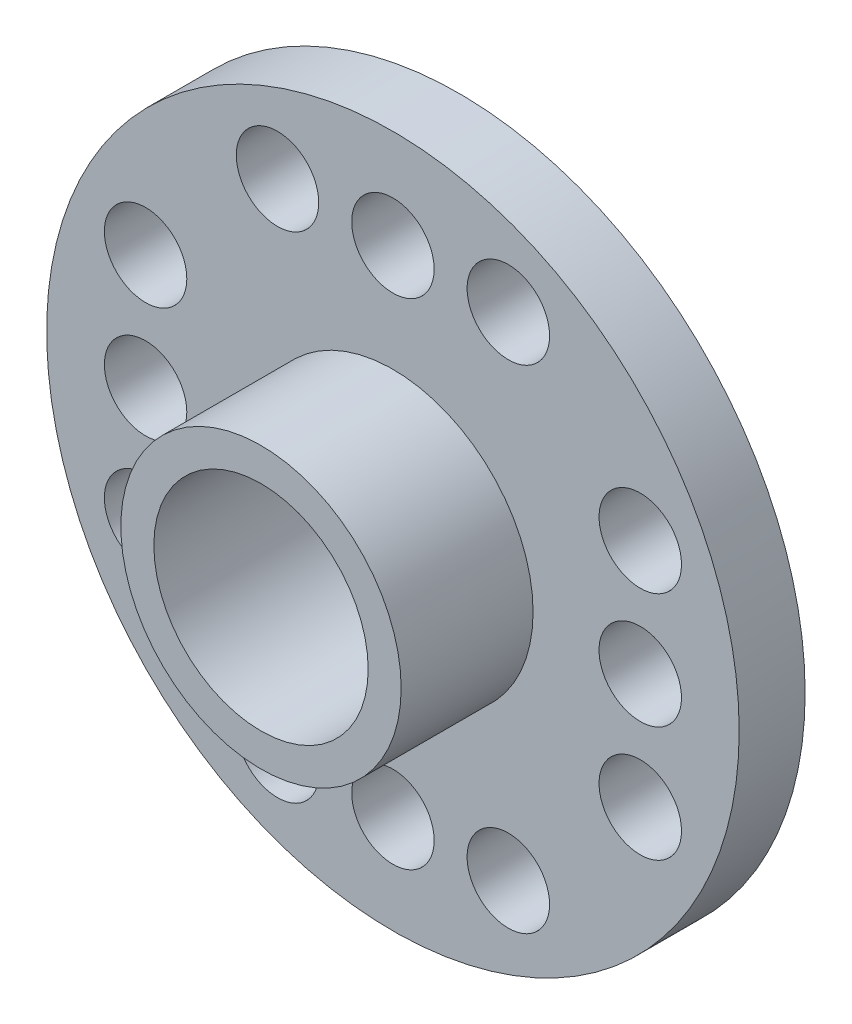
ISO-10303-21;
HEADER;
FILE_DESCRIPTION(('STEP AP214'),'2;1');
FILE_NAME('part.step','',(''),(''),'','','');
FILE_SCHEMA(('AUTOMOTIVE_DESIGN { 1 0 10303 214 1 1 1 1 }'));
ENDSEC;
DATA;
#1=APPLICATION_CONTEXT('core data for automotive mechanical design processes');
#2=APPLICATION_PROTOCOL_DEFINITION('international standard','automotive_design',2000,#1);
#3=PRODUCT_CONTEXT('',#1,'mechanical');
#4=PRODUCT('Part','Part','',(#3));
#5=PRODUCT_RELATED_PRODUCT_CATEGORY('part','',(#4));
#6=PRODUCT_DEFINITION_FORMATION('','',#4);
#7=PRODUCT_DEFINITION_CONTEXT('part definition',#1,'design');
#8=PRODUCT_DEFINITION('design','',#6,#7);
#9=PRODUCT_DEFINITION_SHAPE('','',#8);
#10=(LENGTH_UNIT() NAMED_UNIT(*) SI_UNIT(.MILLI.,.METRE.));
#11=(NAMED_UNIT(*) PLANE_ANGLE_UNIT() SI_UNIT($,.RADIAN.));
#12=(NAMED_UNIT(*) SI_UNIT($,.STERADIAN.) SOLID_ANGLE_UNIT());
#13=UNCERTAINTY_MEASURE_WITH_UNIT(LENGTH_MEASURE(1.E-05),#10,'distance_accuracy_value','');
#14=(GEOMETRIC_REPRESENTATION_CONTEXT(3) GLOBAL_UNCERTAINTY_ASSIGNED_CONTEXT((#13)) GLOBAL_UNIT_ASSIGNED_CONTEXT((#10,
#11,#12)) REPRESENTATION_CONTEXT('',''));
#15=CARTESIAN_POINT('',(0.,0.,0.));
#16=DIRECTION('',(0.,0.,1.));
#17=DIRECTION('',(1.,0.,0.));
#18=AXIS2_PLACEMENT_3D('',#15,#16,#17);
#19=CARTESIAN_POINT('',(0.,0.,2.));
#20=DIRECTION('',(0.,0.,1.));
#21=DIRECTION('',(1.,0.,0.));
#22=AXIS2_PLACEMENT_3D('',#19,#20,#21);
#23=PLANE('',#22);
#24=CARTESIAN_POINT('',(7.5,-3.5,2.));
#25=DIRECTION('',(0.,0.,1.));
#26=DIRECTION('',(1.,0.,0.));
#27=AXIS2_PLACEMENT_3D('',#24,#25,#26);
#28=CIRCLE('',#27,1.25);
#29=CARTESIAN_POINT('',(8.75,-3.5,2.));
#30=VERTEX_POINT('',#29);
#31=EDGE_CURVE('E106',#30,#30,#28,.T.);
#32=ORIENTED_EDGE('',*,*,#31,.F.);
#33=EDGE_LOOP('',(#32));
#34=FACE_BOUND('',#33,.T.);
#35=CARTESIAN_POINT('',(-3.5,-7.5,2.));
#36=DIRECTION('',(0.,0.,1.));
#37=DIRECTION('',(1.,0.,0.));
#38=AXIS2_PLACEMENT_3D('',#35,#36,#37);
#39=CIRCLE('',#38,1.25);
#40=CARTESIAN_POINT('',(-2.25,-7.5,2.));
#41=VERTEX_POINT('',#40);
#42=EDGE_CURVE('E94',#41,#41,#39,.T.);
#43=ORIENTED_EDGE('',*,*,#42,.F.);
#44=EDGE_LOOP('',(#43));
#45=FACE_BOUND('',#44,.T.);
#46=CARTESIAN_POINT('',(7.5,3.5,2.));
#47=DIRECTION('',(0.,0.,1.));
#48=DIRECTION('',(1.,0.,0.));
#49=AXIS2_PLACEMENT_3D('',#46,#47,#48);
#50=CIRCLE('',#49,1.25);
#51=CARTESIAN_POINT('',(8.75,3.5,2.));
#52=VERTEX_POINT('',#51);
#53=EDGE_CURVE('E82',#52,#52,#50,.T.);
#54=ORIENTED_EDGE('',*,*,#53,.F.);
#55=EDGE_LOOP('',(#54));
#56=FACE_BOUND('',#55,.T.);
#57=CARTESIAN_POINT('',(7.5,0.,2.));
#58=DIRECTION('',(0.,0.,1.));
#59=DIRECTION('',(1.,0.,0.));
#60=AXIS2_PLACEMENT_3D('',#57,#58,#59);
#61=CIRCLE('',#60,1.25);
#62=CARTESIAN_POINT('',(8.75,0.,2.));
#63=VERTEX_POINT('',#62);
#64=EDGE_CURVE('E70',#63,#63,#61,.T.);
#65=ORIENTED_EDGE('',*,*,#64,.F.);
#66=EDGE_LOOP('',(#65));
#67=FACE_BOUND('',#66,.T.);
#68=CARTESIAN_POINT('',(-7.5,0.,2.));
#69=DIRECTION('',(0.,0.,1.));
#70=DIRECTION('',(1.,0.,0.));
#71=AXIS2_PLACEMENT_3D('',#68,#69,#70);
#72=CIRCLE('',#71,1.25);
#73=CARTESIAN_POINT('',(-6.25,0.,2.));
#74=VERTEX_POINT('',#73);
#75=EDGE_CURVE('E58',#74,#74,#72,.T.);
#76=ORIENTED_EDGE('',*,*,#75,.F.);
#77=EDGE_LOOP('',(#76));
#78=FACE_BOUND('',#77,.T.);
#79=CARTESIAN_POINT('',(-3.5,7.5,2.));
#80=DIRECTION('',(0.,0.,1.));
#81=DIRECTION('',(1.,0.,0.));
#82=AXIS2_PLACEMENT_3D('',#79,#80,#81);
#83=CIRCLE('',#82,1.25);
#84=CARTESIAN_POINT('',(-2.25,7.5,2.));
#85=VERTEX_POINT('',#84);
#86=EDGE_CURVE('E46',#85,#85,#83,.T.);
#87=ORIENTED_EDGE('',*,*,#86,.F.);
#88=EDGE_LOOP('',(#87));
#89=FACE_BOUND('',#88,.T.);
#90=CARTESIAN_POINT('',(0.,0.,2.));
#91=DIRECTION('',(0.,0.,1.));
#92=DIRECTION('',(1.,0.,0.));
#93=AXIS2_PLACEMENT_3D('',#90,#91,#92);
#94=CIRCLE('',#93,10.5);
#95=CARTESIAN_POINT('',(10.5,0.,2.));
#96=VERTEX_POINT('',#95);
#97=EDGE_CURVE('E10',#96,#96,#94,.T.);
#98=ORIENTED_EDGE('',*,*,#97,.T.);
#99=EDGE_LOOP('',(#98));
#100=FACE_BOUND('',#99,.T.);
#101=CARTESIAN_POINT('',(0.,7.5,2.));
#102=DIRECTION('',(0.,0.,1.));
#103=DIRECTION('',(1.,0.,0.));
#104=AXIS2_PLACEMENT_3D('',#101,#102,#103);
#105=CIRCLE('',#104,1.25);
#106=CARTESIAN_POINT('',(1.25,7.5,2.));
#107=VERTEX_POINT('',#106);
#108=EDGE_CURVE('E41',#107,#107,#105,.T.);
#109=ORIENTED_EDGE('',*,*,#108,.F.);
#110=EDGE_LOOP('',(#109));
#111=FACE_BOUND('',#110,.T.);
#112=CARTESIAN_POINT('',(3.5,7.5,2.));
#113=DIRECTION('',(0.,0.,1.));
#114=DIRECTION('',(1.,0.,0.));
#115=AXIS2_PLACEMENT_3D('',#112,#113,#114);
#116=CIRCLE('',#115,1.25);
#117=CARTESIAN_POINT('',(4.75,7.5,2.));
#118=VERTEX_POINT('',#117);
#119=EDGE_CURVE('E52',#118,#118,#116,.T.);
#120=ORIENTED_EDGE('',*,*,#119,.F.);
#121=EDGE_LOOP('',(#120));
#122=FACE_BOUND('',#121,.T.);
#123=CARTESIAN_POINT('',(-7.5,3.5,2.));
#124=DIRECTION('',(0.,0.,1.));
#125=DIRECTION('',(1.,0.,0.));
#126=AXIS2_PLACEMENT_3D('',#123,#124,#125);
#127=CIRCLE('',#126,1.25);
#128=CARTESIAN_POINT('',(-6.25,3.5,2.));
#129=VERTEX_POINT('',#128);
#130=EDGE_CURVE('E64',#129,#129,#127,.T.);
#131=ORIENTED_EDGE('',*,*,#130,.F.);
#132=EDGE_LOOP('',(#131));
#133=FACE_BOUND('',#132,.T.);
#134=CARTESIAN_POINT('',(-7.5,-3.5,2.));
#135=DIRECTION('',(0.,0.,1.));
#136=DIRECTION('',(1.,0.,0.));
#137=AXIS2_PLACEMENT_3D('',#134,#135,#136);
#138=CIRCLE('',#137,1.25);
#139=CARTESIAN_POINT('',(-6.25,-3.5,2.));
#140=VERTEX_POINT('',#139);
#141=EDGE_CURVE('E76',#140,#140,#138,.T.);
#142=ORIENTED_EDGE('',*,*,#141,.F.);
#143=EDGE_LOOP('',(#142));
#144=FACE_BOUND('',#143,.T.);
#145=CARTESIAN_POINT('',(0.,-7.5,2.));
#146=DIRECTION('',(0.,0.,1.));
#147=DIRECTION('',(1.,0.,0.));
#148=AXIS2_PLACEMENT_3D('',#145,#146,#147);
#149=CIRCLE('',#148,1.25);
#150=CARTESIAN_POINT('',(1.25,-7.5,2.));
#151=VERTEX_POINT('',#150);
#152=EDGE_CURVE('E88',#151,#151,#149,.T.);
#153=ORIENTED_EDGE('',*,*,#152,.F.);
#154=EDGE_LOOP('',(#153));
#155=FACE_BOUND('',#154,.T.);
#156=CARTESIAN_POINT('',(3.49926490451762,-7.42827045231363,2.));
#157=DIRECTION('',(0.,0.,1.));
#158=DIRECTION('',(1.,0.,0.));
#159=AXIS2_PLACEMENT_3D('',#156,#157,#158);
#160=CIRCLE('',#159,1.25);
#161=CARTESIAN_POINT('',(4.74926490451762,-7.42827045231363,2.));
#162=VERTEX_POINT('',#161);
#163=EDGE_CURVE('E100',#162,#162,#160,.T.);
#164=ORIENTED_EDGE('',*,*,#163,.F.);
#165=EDGE_LOOP('',(#164));
#166=FACE_BOUND('',#165,.T.);
#167=CARTESIAN_POINT('',(0.,0.,2.));
#168=DIRECTION('',(0.,0.,1.));
#169=DIRECTION('',(1.,0.,0.));
#170=AXIS2_PLACEMENT_3D('',#167,#168,#169);
#171=CIRCLE('',#170,4.25);
#172=CARTESIAN_POINT('',(4.25,0.,2.));
#173=VERTEX_POINT('',#172);
#174=EDGE_CURVE('E118',#173,#173,#171,.T.);
#175=ORIENTED_EDGE('',*,*,#174,.F.);
#176=EDGE_LOOP('',(#175));
#177=FACE_BOUND('',#176,.T.);
#178=ADVANCED_FACE('F30',(#34,#45,#56,#67,#78,#89,#100,#111,#122,#133,#144,#155,#166,#177),#23,.T.);
#179=CARTESIAN_POINT('',(0.,0.,0.));
#180=DIRECTION('',(0.,0.,1.));
#181=DIRECTION('',(1.,0.,0.));
#182=AXIS2_PLACEMENT_3D('',#179,#180,#181);
#183=PLANE('',#182);
#184=CARTESIAN_POINT('',(0.,0.,0.));
#185=DIRECTION('',(0.,0.,-1.));
#186=DIRECTION('',(-1.,0.,0.));
#187=AXIS2_PLACEMENT_3D('',#184,#185,#186);
#188=CIRCLE('',#187,3.25);
#189=CARTESIAN_POINT('',(-3.25,0.,0.));
#190=VERTEX_POINT('',#189);
#191=EDGE_CURVE('E112',#190,#190,#188,.T.);
#192=ORIENTED_EDGE('',*,*,#191,.F.);
#193=EDGE_LOOP('',(#192));
#194=FACE_BOUND('',#193,.T.);
#195=CARTESIAN_POINT('',(0.,0.,0.));
#196=DIRECTION('',(0.,0.,1.));
#197=DIRECTION('',(1.,0.,0.));
#198=AXIS2_PLACEMENT_3D('',#195,#196,#197);
#199=CIRCLE('',#198,10.5);
#200=CARTESIAN_POINT('',(10.5,0.,0.));
#201=VERTEX_POINT('',#200);
#202=EDGE_CURVE('E34',#201,#201,#199,.T.);
#203=ORIENTED_EDGE('',*,*,#202,.F.);
#204=EDGE_LOOP('',(#203));
#205=FACE_BOUND('',#204,.T.);
#206=CARTESIAN_POINT('',(0.,7.5,0.));
#207=DIRECTION('',(0.,0.,1.));
#208=DIRECTION('',(1.,0.,0.));
#209=AXIS2_PLACEMENT_3D('',#206,#207,#208);
#210=CIRCLE('',#209,1.25);
#211=CARTESIAN_POINT('',(1.25,7.5,0.));
#212=VERTEX_POINT('',#211);
#213=EDGE_CURVE('E43',#212,#212,#210,.T.);
#214=ORIENTED_EDGE('',*,*,#213,.T.);
#215=EDGE_LOOP('',(#214));
#216=FACE_BOUND('',#215,.T.);
#217=CARTESIAN_POINT('',(-3.5,7.5,0.));
#218=DIRECTION('',(0.,0.,1.));
#219=DIRECTION('',(1.,0.,0.));
#220=AXIS2_PLACEMENT_3D('',#217,#218,#219);
#221=CIRCLE('',#220,1.25);
#222=CARTESIAN_POINT('',(-2.25,7.5,0.));
#223=VERTEX_POINT('',#222);
#224=EDGE_CURVE('E49',#223,#223,#221,.T.);
#225=ORIENTED_EDGE('',*,*,#224,.T.);
#226=EDGE_LOOP('',(#225));
#227=FACE_BOUND('',#226,.T.);
#228=CARTESIAN_POINT('',(3.5,7.5,0.));
#229=DIRECTION('',(0.,0.,1.));
#230=DIRECTION('',(1.,0.,0.));
#231=AXIS2_PLACEMENT_3D('',#228,#229,#230);
#232=CIRCLE('',#231,1.25);
#233=CARTESIAN_POINT('',(4.75,7.5,0.));
#234=VERTEX_POINT('',#233);
#235=EDGE_CURVE('E55',#234,#234,#232,.T.);
#236=ORIENTED_EDGE('',*,*,#235,.T.);
#237=EDGE_LOOP('',(#236));
#238=FACE_BOUND('',#237,.T.);
#239=CARTESIAN_POINT('',(-7.5,0.,0.));
#240=DIRECTION('',(0.,0.,1.));
#241=DIRECTION('',(1.,0.,0.));
#242=AXIS2_PLACEMENT_3D('',#239,#240,#241);
#243=CIRCLE('',#242,1.25);
#244=CARTESIAN_POINT('',(-6.25,0.,0.));
#245=VERTEX_POINT('',#244);
#246=EDGE_CURVE('E61',#245,#245,#243,.T.);
#247=ORIENTED_EDGE('',*,*,#246,.T.);
#248=EDGE_LOOP('',(#247));
#249=FACE_BOUND('',#248,.T.);
#250=CARTESIAN_POINT('',(-7.5,3.5,0.));
#251=DIRECTION('',(0.,0.,1.));
#252=DIRECTION('',(1.,0.,0.));
#253=AXIS2_PLACEMENT_3D('',#250,#251,#252);
#254=CIRCLE('',#253,1.25);
#255=CARTESIAN_POINT('',(-6.25,3.5,0.));
#256=VERTEX_POINT('',#255);
#257=EDGE_CURVE('E67',#256,#256,#254,.T.);
#258=ORIENTED_EDGE('',*,*,#257,.T.);
#259=EDGE_LOOP('',(#258));
#260=FACE_BOUND('',#259,.T.);
#261=CARTESIAN_POINT('',(7.5,0.,0.));
#262=DIRECTION('',(0.,0.,1.));
#263=DIRECTION('',(1.,0.,0.));
#264=AXIS2_PLACEMENT_3D('',#261,#262,#263);
#265=CIRCLE('',#264,1.25);
#266=CARTESIAN_POINT('',(8.75,0.,0.));
#267=VERTEX_POINT('',#266);
#268=EDGE_CURVE('E73',#267,#267,#265,.T.);
#269=ORIENTED_EDGE('',*,*,#268,.T.);
#270=EDGE_LOOP('',(#269));
#271=FACE_BOUND('',#270,.T.);
#272=CARTESIAN_POINT('',(-7.5,-3.5,0.));
#273=DIRECTION('',(0.,0.,1.));
#274=DIRECTION('',(1.,0.,0.));
#275=AXIS2_PLACEMENT_3D('',#272,#273,#274);
#276=CIRCLE('',#275,1.25);
#277=CARTESIAN_POINT('',(-6.25,-3.5,0.));
#278=VERTEX_POINT('',#277);
#279=EDGE_CURVE('E79',#278,#278,#276,.T.);
#280=ORIENTED_EDGE('',*,*,#279,.T.);
#281=EDGE_LOOP('',(#280));
#282=FACE_BOUND('',#281,.T.);
#283=CARTESIAN_POINT('',(7.5,3.5,0.));
#284=DIRECTION('',(0.,0.,1.));
#285=DIRECTION('',(1.,0.,0.));
#286=AXIS2_PLACEMENT_3D('',#283,#284,#285);
#287=CIRCLE('',#286,1.25);
#288=CARTESIAN_POINT('',(8.75,3.5,0.));
#289=VERTEX_POINT('',#288);
#290=EDGE_CURVE('E85',#289,#289,#287,.T.);
#291=ORIENTED_EDGE('',*,*,#290,.T.);
#292=EDGE_LOOP('',(#291));
#293=FACE_BOUND('',#292,.T.);
#294=CARTESIAN_POINT('',(0.,-7.5,0.));
#295=DIRECTION('',(0.,0.,1.));
#296=DIRECTION('',(1.,0.,0.));
#297=AXIS2_PLACEMENT_3D('',#294,#295,#296);
#298=CIRCLE('',#297,1.25);
#299=CARTESIAN_POINT('',(1.25,-7.5,0.));
#300=VERTEX_POINT('',#299);
#301=EDGE_CURVE('E91',#300,#300,#298,.T.);
#302=ORIENTED_EDGE('',*,*,#301,.T.);
#303=EDGE_LOOP('',(#302));
#304=FACE_BOUND('',#303,.T.);
#305=CARTESIAN_POINT('',(-3.5,-7.5,0.));
#306=DIRECTION('',(0.,0.,1.));
#307=DIRECTION('',(1.,0.,0.));
#308=AXIS2_PLACEMENT_3D('',#305,#306,#307);
#309=CIRCLE('',#308,1.25);
#310=CARTESIAN_POINT('',(-2.25,-7.5,0.));
#311=VERTEX_POINT('',#310);
#312=EDGE_CURVE('E97',#311,#311,#309,.T.);
#313=ORIENTED_EDGE('',*,*,#312,.T.);
#314=EDGE_LOOP('',(#313));
#315=FACE_BOUND('',#314,.T.);
#316=CARTESIAN_POINT('',(3.49926490451762,-7.42827045231363,0.));
#317=DIRECTION('',(0.,0.,1.));
#318=DIRECTION('',(1.,0.,0.));
#319=AXIS2_PLACEMENT_3D('',#316,#317,#318);
#320=CIRCLE('',#319,1.25);
#321=CARTESIAN_POINT('',(4.74926490451762,-7.42827045231363,0.));
#322=VERTEX_POINT('',#321);
#323=EDGE_CURVE('E103',#322,#322,#320,.T.);
#324=ORIENTED_EDGE('',*,*,#323,.T.);
#325=EDGE_LOOP('',(#324));
#326=FACE_BOUND('',#325,.T.);
#327=CARTESIAN_POINT('',(7.5,-3.5,0.));
#328=DIRECTION('',(0.,0.,1.));
#329=DIRECTION('',(1.,0.,0.));
#330=AXIS2_PLACEMENT_3D('',#327,#328,#329);
#331=CIRCLE('',#330,1.25);
#332=CARTESIAN_POINT('',(8.75,-3.5,0.));
#333=VERTEX_POINT('',#332);
#334=EDGE_CURVE('E109',#333,#333,#331,.T.);
#335=ORIENTED_EDGE('',*,*,#334,.T.);
#336=EDGE_LOOP('',(#335));
#337=FACE_BOUND('',#336,.T.);
#338=ADVANCED_FACE('F144',(#194,#205,#216,#227,#238,#249,#260,#271,#282,#293,#304,#315,#326,
#337),#183,.F.);
#339=CARTESIAN_POINT('',(0.,0.,2.));
#340=DIRECTION('',(0.,0.,-1.));
#341=DIRECTION('',(-1.,0.,0.));
#342=AXIS2_PLACEMENT_3D('',#339,#340,#341);
#343=CYLINDRICAL_SURFACE('',#342,10.5);
#344=ORIENTED_EDGE('',*,*,#97,.F.);
#345=EDGE_LOOP('',(#344));
#346=FACE_BOUND('',#345,.T.);
#347=ORIENTED_EDGE('',*,*,#202,.T.);
#348=EDGE_LOOP('',(#347));
#349=FACE_BOUND('',#348,.T.);
#350=ADVANCED_FACE('F32',(#346,#349),#343,.T.);
#351=CARTESIAN_POINT('',(0.,7.5,2.));
#352=DIRECTION('',(0.,0.,-1.));
#353=DIRECTION('',(-1.,0.,0.));
#354=AXIS2_PLACEMENT_3D('',#351,#352,#353);
#355=CYLINDRICAL_SURFACE('',#354,1.25);
#356=ORIENTED_EDGE('',*,*,#108,.T.);
#357=EDGE_LOOP('',(#356));
#358=FACE_BOUND('',#357,.T.);
#359=ORIENTED_EDGE('',*,*,#213,.F.);
#360=EDGE_LOOP('',(#359));
#361=FACE_BOUND('',#360,.T.);
#362=ADVANCED_FACE('F154',(#358,#361),#355,.F.);
#363=CARTESIAN_POINT('',(-3.5,7.5,2.));
#364=DIRECTION('',(0.,0.,-1.));
#365=DIRECTION('',(-1.,0.,0.));
#366=AXIS2_PLACEMENT_3D('',#363,#364,#365);
#367=CYLINDRICAL_SURFACE('',#366,1.25);
#368=ORIENTED_EDGE('',*,*,#86,.T.);
#369=EDGE_LOOP('',(#368));
#370=FACE_BOUND('',#369,.T.);
#371=ORIENTED_EDGE('',*,*,#224,.F.);
#372=EDGE_LOOP('',(#371));
#373=FACE_BOUND('',#372,.T.);
#374=ADVANCED_FACE('F157',(#370,#373),#367,.F.);
#375=CARTESIAN_POINT('',(3.5,7.5,2.));
#376=DIRECTION('',(0.,0.,-1.));
#377=DIRECTION('',(-1.,0.,0.));
#378=AXIS2_PLACEMENT_3D('',#375,#376,#377);
#379=CYLINDRICAL_SURFACE('',#378,1.25);
#380=ORIENTED_EDGE('',*,*,#119,.T.);
#381=EDGE_LOOP('',(#380));
#382=FACE_BOUND('',#381,.T.);
#383=ORIENTED_EDGE('',*,*,#235,.F.);
#384=EDGE_LOOP('',(#383));
#385=FACE_BOUND('',#384,.T.);
#386=ADVANCED_FACE('F161',(#382,#385),#379,.F.);
#387=CARTESIAN_POINT('',(-7.5,0.,2.));
#388=DIRECTION('',(0.,0.,-1.));
#389=DIRECTION('',(-1.,0.,0.));
#390=AXIS2_PLACEMENT_3D('',#387,#388,#389);
#391=CYLINDRICAL_SURFACE('',#390,1.25);
#392=ORIENTED_EDGE('',*,*,#75,.T.);
#393=EDGE_LOOP('',(#392));
#394=FACE_BOUND('',#393,.T.);
#395=ORIENTED_EDGE('',*,*,#246,.F.);
#396=EDGE_LOOP('',(#395));
#397=FACE_BOUND('',#396,.T.);
#398=ADVANCED_FACE('F165',(#394,#397),#391,.F.);
#399=CARTESIAN_POINT('',(-7.5,3.5,2.));
#400=DIRECTION('',(0.,0.,-1.));
#401=DIRECTION('',(-1.,0.,0.));
#402=AXIS2_PLACEMENT_3D('',#399,#400,#401);
#403=CYLINDRICAL_SURFACE('',#402,1.25);
#404=ORIENTED_EDGE('',*,*,#130,.T.);
#405=EDGE_LOOP('',(#404));
#406=FACE_BOUND('',#405,.T.);
#407=ORIENTED_EDGE('',*,*,#257,.F.);
#408=EDGE_LOOP('',(#407));
#409=FACE_BOUND('',#408,.T.);
#410=ADVANCED_FACE('F169',(#406,#409),#403,.F.);
#411=CARTESIAN_POINT('',(7.5,0.,2.));
#412=DIRECTION('',(0.,0.,-1.));
#413=DIRECTION('',(-1.,0.,0.));
#414=AXIS2_PLACEMENT_3D('',#411,#412,#413);
#415=CYLINDRICAL_SURFACE('',#414,1.25);
#416=ORIENTED_EDGE('',*,*,#64,.T.);
#417=EDGE_LOOP('',(#416));
#418=FACE_BOUND('',#417,.T.);
#419=ORIENTED_EDGE('',*,*,#268,.F.);
#420=EDGE_LOOP('',(#419));
#421=FACE_BOUND('',#420,.T.);
#422=ADVANCED_FACE('F173',(#418,#421),#415,.F.);
#423=CARTESIAN_POINT('',(-7.5,-3.5,2.));
#424=DIRECTION('',(0.,0.,-1.));
#425=DIRECTION('',(-1.,0.,0.));
#426=AXIS2_PLACEMENT_3D('',#423,#424,#425);
#427=CYLINDRICAL_SURFACE('',#426,1.25);
#428=ORIENTED_EDGE('',*,*,#141,.T.);
#429=EDGE_LOOP('',(#428));
#430=FACE_BOUND('',#429,.T.);
#431=ORIENTED_EDGE('',*,*,#279,.F.);
#432=EDGE_LOOP('',(#431));
#433=FACE_BOUND('',#432,.T.);
#434=ADVANCED_FACE('F177',(#430,#433),#427,.F.);
#435=CARTESIAN_POINT('',(7.5,3.5,2.));
#436=DIRECTION('',(0.,0.,-1.));
#437=DIRECTION('',(-1.,0.,0.));
#438=AXIS2_PLACEMENT_3D('',#435,#436,#437);
#439=CYLINDRICAL_SURFACE('',#438,1.25);
#440=ORIENTED_EDGE('',*,*,#53,.T.);
#441=EDGE_LOOP('',(#440));
#442=FACE_BOUND('',#441,.T.);
#443=ORIENTED_EDGE('',*,*,#290,.F.);
#444=EDGE_LOOP('',(#443));
#445=FACE_BOUND('',#444,.T.);
#446=ADVANCED_FACE('F181',(#442,#445),#439,.F.);
#447=CARTESIAN_POINT('',(0.,-7.5,2.));
#448=DIRECTION('',(0.,0.,-1.));
#449=DIRECTION('',(-1.,0.,0.));
#450=AXIS2_PLACEMENT_3D('',#447,#448,#449);
#451=CYLINDRICAL_SURFACE('',#450,1.25);
#452=ORIENTED_EDGE('',*,*,#152,.T.);
#453=EDGE_LOOP('',(#452));
#454=FACE_BOUND('',#453,.T.);
#455=ORIENTED_EDGE('',*,*,#301,.F.);
#456=EDGE_LOOP('',(#455));
#457=FACE_BOUND('',#456,.T.);
#458=ADVANCED_FACE('F185',(#454,#457),#451,.F.);
#459=CARTESIAN_POINT('',(-3.5,-7.5,2.));
#460=DIRECTION('',(0.,0.,-1.));
#461=DIRECTION('',(-1.,0.,0.));
#462=AXIS2_PLACEMENT_3D('',#459,#460,#461);
#463=CYLINDRICAL_SURFACE('',#462,1.25);
#464=ORIENTED_EDGE('',*,*,#42,.T.);
#465=EDGE_LOOP('',(#464));
#466=FACE_BOUND('',#465,.T.);
#467=ORIENTED_EDGE('',*,*,#312,.F.);
#468=EDGE_LOOP('',(#467));
#469=FACE_BOUND('',#468,.T.);
#470=ADVANCED_FACE('F189',(#466,#469),#463,.F.);
#471=CARTESIAN_POINT('',(3.49926490451762,-7.42827045231363,2.));
#472=DIRECTION('',(0.,0.,-1.));
#473=DIRECTION('',(-1.,0.,0.));
#474=AXIS2_PLACEMENT_3D('',#471,#472,#473);
#475=CYLINDRICAL_SURFACE('',#474,1.25);
#476=ORIENTED_EDGE('',*,*,#163,.T.);
#477=EDGE_LOOP('',(#476));
#478=FACE_BOUND('',#477,.T.);
#479=ORIENTED_EDGE('',*,*,#323,.F.);
#480=EDGE_LOOP('',(#479));
#481=FACE_BOUND('',#480,.T.);
#482=ADVANCED_FACE('F193',(#478,#481),#475,.F.);
#483=CARTESIAN_POINT('',(7.5,-3.5,2.));
#484=DIRECTION('',(0.,0.,-1.));
#485=DIRECTION('',(-1.,0.,0.));
#486=AXIS2_PLACEMENT_3D('',#483,#484,#485);
#487=CYLINDRICAL_SURFACE('',#486,1.25);
#488=ORIENTED_EDGE('',*,*,#31,.T.);
#489=EDGE_LOOP('',(#488));
#490=FACE_BOUND('',#489,.T.);
#491=ORIENTED_EDGE('',*,*,#334,.F.);
#492=EDGE_LOOP('',(#491));
#493=FACE_BOUND('',#492,.T.);
#494=ADVANCED_FACE('F140',(#490,#493),#487,.F.);
#495=CARTESIAN_POINT('',(0.,0.,2.));
#496=DIRECTION('',(0.,0.,-1.));
#497=DIRECTION('',(-1.,0.,0.));
#498=AXIS2_PLACEMENT_3D('',#495,#496,#497);
#499=CYLINDRICAL_SURFACE('',#498,3.25);
#500=ORIENTED_EDGE('',*,*,#191,.T.);
#501=EDGE_LOOP('',(#500));
#502=FACE_BOUND('',#501,.T.);
#503=CARTESIAN_POINT('',(0.,0.,6.));
#504=DIRECTION('',(0.,0.,1.));
#505=DIRECTION('',(1.,0.,0.));
#506=AXIS2_PLACEMENT_3D('',#503,#504,#505);
#507=CIRCLE('',#506,3.25);
#508=CARTESIAN_POINT('',(3.25,0.,6.));
#509=VERTEX_POINT('',#508);
#510=EDGE_CURVE('E121',#509,#509,#507,.T.);
#511=ORIENTED_EDGE('',*,*,#510,.T.);
#512=EDGE_LOOP('',(#511));
#513=FACE_BOUND('',#512,.T.);
#514=ADVANCED_FACE('F127',(#502,#513),#499,.F.);
#515=CARTESIAN_POINT('',(0.,0.,6.));
#516=DIRECTION('',(0.,0.,1.));
#517=DIRECTION('',(1.,0.,0.));
#518=AXIS2_PLACEMENT_3D('',#515,#516,#517);
#519=PLANE('',#518);
#520=CARTESIAN_POINT('',(0.,0.,6.));
#521=DIRECTION('',(0.,0.,1.));
#522=DIRECTION('',(1.,0.,0.));
#523=AXIS2_PLACEMENT_3D('',#520,#521,#522);
#524=CIRCLE('',#523,4.25);
#525=CARTESIAN_POINT('',(4.25,0.,6.));
#526=VERTEX_POINT('',#525);
#527=EDGE_CURVE('E117',#526,#526,#524,.T.);
#528=ORIENTED_EDGE('',*,*,#527,.T.);
#529=EDGE_LOOP('',(#528));
#530=FACE_BOUND('',#529,.T.);
#531=ORIENTED_EDGE('',*,*,#510,.F.);
#532=EDGE_LOOP('',(#531));
#533=FACE_BOUND('',#532,.T.);
#534=ADVANCED_FACE('F129',(#530,#533),#519,.T.);
#535=CARTESIAN_POINT('',(0.,0.,6.));
#536=DIRECTION('',(0.,0.,-1.));
#537=DIRECTION('',(-1.,0.,0.));
#538=AXIS2_PLACEMENT_3D('',#535,#536,#537);
#539=CYLINDRICAL_SURFACE('',#538,4.25);
#540=ORIENTED_EDGE('',*,*,#527,.F.);
#541=EDGE_LOOP('',(#540));
#542=FACE_BOUND('',#541,.T.);
#543=ORIENTED_EDGE('',*,*,#174,.T.);
#544=EDGE_LOOP('',(#543));
#545=FACE_BOUND('',#544,.T.);
#546=ADVANCED_FACE('F131',(#542,#545),#539,.T.);
#547=CLOSED_SHELL('',(#178,#338,#350,#362,#374,#386,#398,#410,#422,#434,#446,#458,#470,#482,
#494,#514,#534,#546));
#548=MANIFOLD_SOLID_BREP('B2',#547);
#549=ADVANCED_BREP_SHAPE_REPRESENTATION('',(#18,#548),#14);
#550=SHAPE_DEFINITION_REPRESENTATION(#9,#549);
ENDSEC;
END-ISO-10303-21;
